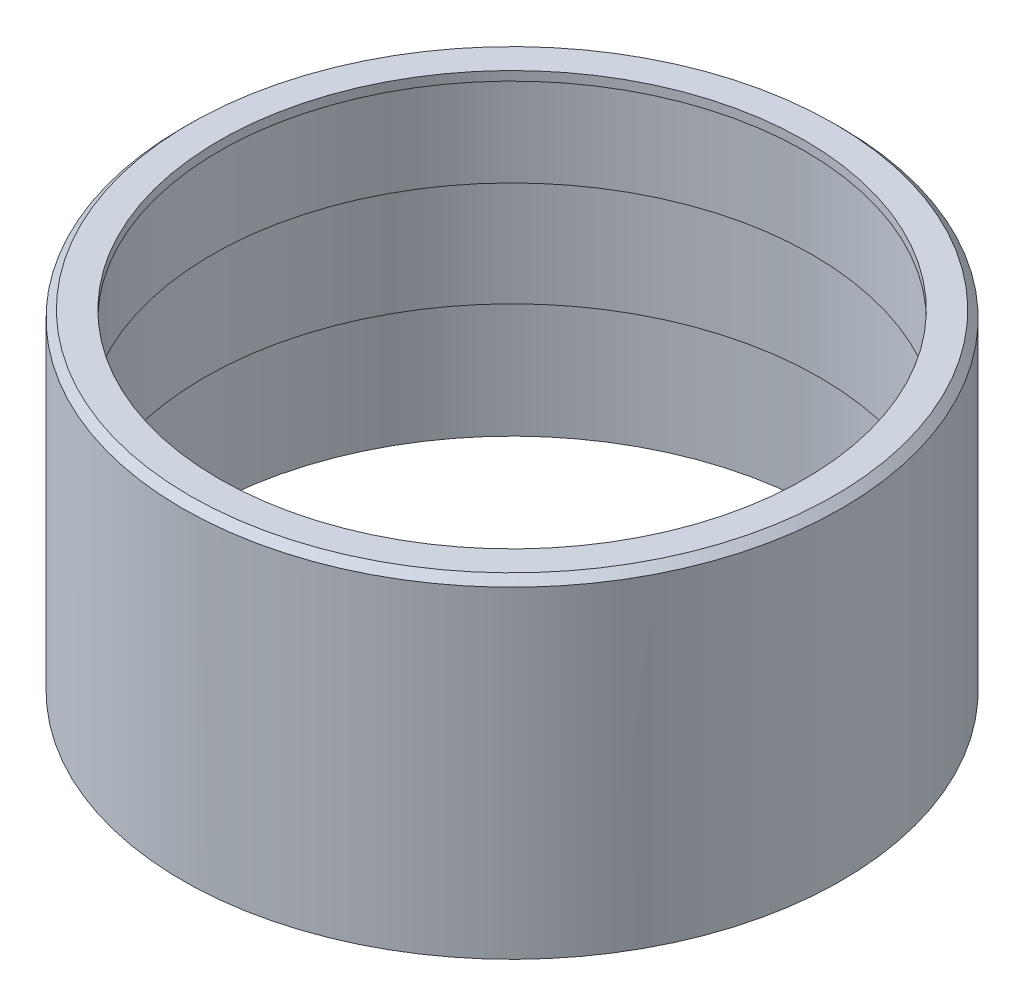
ISO-10303-21;
HEADER;
FILE_DESCRIPTION(('STEP AP214'),'2;1');
FILE_NAME('part.step','',(''),(''),'','','');
FILE_SCHEMA(('AUTOMOTIVE_DESIGN { 1 0 10303 214 1 1 1 1 }'));
ENDSEC;
DATA;
#1=APPLICATION_CONTEXT('core data for automotive mechanical design processes');
#2=APPLICATION_PROTOCOL_DEFINITION('international standard','automotive_design',2000,#1);
#3=PRODUCT_CONTEXT('',#1,'mechanical');
#4=PRODUCT('Part','Part','',(#3));
#5=PRODUCT_RELATED_PRODUCT_CATEGORY('part','',(#4));
#6=PRODUCT_DEFINITION_FORMATION('','',#4);
#7=PRODUCT_DEFINITION_CONTEXT('part definition',#1,'design');
#8=PRODUCT_DEFINITION('design','',#6,#7);
#9=PRODUCT_DEFINITION_SHAPE('','',#8);
#10=(LENGTH_UNIT() NAMED_UNIT(*) SI_UNIT(.MILLI.,.METRE.));
#11=(NAMED_UNIT(*) PLANE_ANGLE_UNIT() SI_UNIT($,.RADIAN.));
#12=(NAMED_UNIT(*) SI_UNIT($,.STERADIAN.) SOLID_ANGLE_UNIT());
#13=UNCERTAINTY_MEASURE_WITH_UNIT(LENGTH_MEASURE(1.E-05),#10,'distance_accuracy_value','');
#14=(GEOMETRIC_REPRESENTATION_CONTEXT(3) GLOBAL_UNCERTAINTY_ASSIGNED_CONTEXT((#13)) GLOBAL_UNIT_ASSIGNED_CONTEXT((#10,
#11,#12)) REPRESENTATION_CONTEXT('',''));
#15=CARTESIAN_POINT('',(0.,0.,0.));
#16=DIRECTION('',(0.,0.,1.));
#17=DIRECTION('',(1.,0.,0.));
#18=AXIS2_PLACEMENT_3D('',#15,#16,#17);
#19=CARTESIAN_POINT('',(22.86,22.86,0.));
#20=DIRECTION('',(0.,1.,0.));
#21=DIRECTION('',(0.,0.,1.));
#22=AXIS2_PLACEMENT_3D('',#19,#20,#21);
#23=PLANE('',#22);
#24=CARTESIAN_POINT('',(0.,22.86,0.));
#25=DIRECTION('',(0.,1.,0.));
#26=DIRECTION('',(0.,0.,1.));
#27=AXIS2_PLACEMENT_3D('',#24,#25,#26);
#28=CIRCLE('',#27,22.352);
#29=CARTESIAN_POINT('',(0.,22.86,22.352));
#30=VERTEX_POINT('',#29);
#31=EDGE_CURVE('E11',#30,#30,#28,.T.);
#32=ORIENTED_EDGE('',*,*,#31,.T.);
#33=EDGE_LOOP('',(#32));
#34=FACE_BOUND('',#33,.T.);
#35=CARTESIAN_POINT('',(0.,22.86,0.));
#36=DIRECTION('',(0.,-1.,0.));
#37=DIRECTION('',(0.,0.,-1.));
#38=AXIS2_PLACEMENT_3D('',#35,#36,#37);
#39=CIRCLE('',#38,20.32);
#40=CARTESIAN_POINT('',(0.,22.86,-20.32));
#41=VERTEX_POINT('',#40);
#42=EDGE_CURVE('E78',#41,#41,#39,.T.);
#43=ORIENTED_EDGE('',*,*,#42,.T.);
#44=EDGE_LOOP('',(#43));
#45=FACE_BOUND('',#44,.T.);
#46=ADVANCED_FACE('F43',(#34,#45),#23,.T.);
#47=CARTESIAN_POINT('',(0.,-7.74131889682308,0.));
#48=DIRECTION('',(0.,-1.,0.));
#49=DIRECTION('',(0.,0.,-1.));
#50=AXIS2_PLACEMENT_3D('',#47,#48,#49);
#51=CYLINDRICAL_SURFACE('',#50,22.86);
#52=CARTESIAN_POINT('',(0.,22.352,0.));
#53=DIRECTION('',(0.,1.,0.));
#54=DIRECTION('',(0.,0.,1.));
#55=AXIS2_PLACEMENT_3D('',#52,#53,#54);
#56=CIRCLE('',#55,22.86);
#57=CARTESIAN_POINT('',(0.,22.352,22.86));
#58=VERTEX_POINT('',#57);
#59=EDGE_CURVE('E50',#58,#58,#56,.F.);
#60=ORIENTED_EDGE('',*,*,#59,.T.);
#61=EDGE_LOOP('',(#60));
#62=FACE_BOUND('',#61,.T.);
#63=CARTESIAN_POINT('',(0.,0.,0.));
#64=DIRECTION('',(0.,-1.,0.));
#65=DIRECTION('',(0.,0.,-1.));
#66=AXIS2_PLACEMENT_3D('',#63,#64,#65);
#67=CIRCLE('',#66,22.86);
#68=CARTESIAN_POINT('',(0.,0.,-22.86));
#69=VERTEX_POINT('',#68);
#70=EDGE_CURVE('E54',#69,#69,#67,.T.);
#71=ORIENTED_EDGE('',*,*,#70,.F.);
#72=EDGE_LOOP('',(#71));
#73=FACE_BOUND('',#72,.T.);
#74=ADVANCED_FACE('F89',(#62,#73),#51,.T.);
#75=CARTESIAN_POINT('',(22.225,0.,0.));
#76=DIRECTION('',(0.,-1.,0.));
#77=DIRECTION('',(0.,0.,-1.));
#78=AXIS2_PLACEMENT_3D('',#75,#76,#77);
#79=PLANE('',#78);
#80=ORIENTED_EDGE('',*,*,#70,.T.);
#81=EDGE_LOOP('',(#80));
#82=FACE_BOUND('',#81,.T.);
#83=CARTESIAN_POINT('',(0.,0.,0.));
#84=DIRECTION('',(0.,-1.,0.));
#85=DIRECTION('',(0.,0.,-1.));
#86=AXIS2_PLACEMENT_3D('',#83,#84,#85);
#87=CIRCLE('',#86,21.59);
#88=CARTESIAN_POINT('',(0.,0.,-21.59));
#89=VERTEX_POINT('',#88);
#90=EDGE_CURVE('E81',#89,#89,#87,.T.);
#91=ORIENTED_EDGE('',*,*,#90,.F.);
#92=EDGE_LOOP('',(#91));
#93=FACE_BOUND('',#92,.T.);
#94=ADVANCED_FACE('F87',(#82,#93),#79,.T.);
#95=CARTESIAN_POINT('',(0.,-7.74131889682308,0.));
#96=DIRECTION('',(0.,-1.,0.));
#97=DIRECTION('',(0.,0.,-1.));
#98=AXIS2_PLACEMENT_3D('',#95,#96,#97);
#99=CYLINDRICAL_SURFACE('',#98,21.59);
#100=CARTESIAN_POINT('',(0.,8.128,0.));
#101=DIRECTION('',(0.,-1.,0.));
#102=DIRECTION('',(0.,0.,-1.));
#103=AXIS2_PLACEMENT_3D('',#100,#101,#102);
#104=CIRCLE('',#103,21.59);
#105=CARTESIAN_POINT('',(0.,8.128,-21.59));
#106=VERTEX_POINT('',#105);
#107=EDGE_CURVE('E58',#106,#106,#104,.T.);
#108=ORIENTED_EDGE('',*,*,#107,.F.);
#109=EDGE_LOOP('',(#108));
#110=FACE_BOUND('',#109,.T.);
#111=ORIENTED_EDGE('',*,*,#90,.T.);
#112=EDGE_LOOP('',(#111));
#113=FACE_BOUND('',#112,.T.);
#114=ADVANCED_FACE('F85',(#110,#113),#99,.F.);
#115=CARTESIAN_POINT('',(21.336,8.128,0.));
#116=DIRECTION('',(0.,-1.,0.));
#117=DIRECTION('',(0.,0.,-1.));
#118=AXIS2_PLACEMENT_3D('',#115,#116,#117);
#119=PLANE('',#118);
#120=ORIENTED_EDGE('',*,*,#107,.T.);
#121=EDGE_LOOP('',(#120));
#122=FACE_BOUND('',#121,.T.);
#123=CARTESIAN_POINT('',(0.,8.128,0.));
#124=DIRECTION('',(0.,-1.,0.));
#125=DIRECTION('',(0.,0.,-1.));
#126=AXIS2_PLACEMENT_3D('',#123,#124,#125);
#127=CIRCLE('',#126,21.336);
#128=CARTESIAN_POINT('',(0.,8.128,-21.336));
#129=VERTEX_POINT('',#128);
#130=EDGE_CURVE('E63',#129,#129,#127,.T.);
#131=ORIENTED_EDGE('',*,*,#130,.F.);
#132=EDGE_LOOP('',(#131));
#133=FACE_BOUND('',#132,.T.);
#134=ADVANCED_FACE('F96',(#122,#133),#119,.T.);
#135=CARTESIAN_POINT('',(0.,-7.74131889682308,0.));
#136=DIRECTION('',(0.,-1.,0.));
#137=DIRECTION('',(0.,0.,-1.));
#138=AXIS2_PLACEMENT_3D('',#135,#136,#137);
#139=CYLINDRICAL_SURFACE('',#138,21.336);
#140=ORIENTED_EDGE('',*,*,#130,.T.);
#141=EDGE_LOOP('',(#140));
#142=FACE_BOUND('',#141,.T.);
#143=CARTESIAN_POINT('',(0.,15.748,0.));
#144=DIRECTION('',(0.,-1.,0.));
#145=DIRECTION('',(0.,0.,-1.));
#146=AXIS2_PLACEMENT_3D('',#143,#144,#145);
#147=CIRCLE('',#146,21.336);
#148=CARTESIAN_POINT('',(0.,15.748,-21.336));
#149=VERTEX_POINT('',#148);
#150=EDGE_CURVE('E66',#149,#149,#147,.T.);
#151=ORIENTED_EDGE('',*,*,#150,.F.);
#152=EDGE_LOOP('',(#151));
#153=FACE_BOUND('',#152,.T.);
#154=ADVANCED_FACE('F126',(#142,#153),#139,.F.);
#155=CARTESIAN_POINT('',(20.828,15.748,0.));
#156=DIRECTION('',(0.,-1.,0.));
#157=DIRECTION('',(0.,0.,-1.));
#158=AXIS2_PLACEMENT_3D('',#155,#156,#157);
#159=PLANE('',#158);
#160=ORIENTED_EDGE('',*,*,#150,.T.);
#161=EDGE_LOOP('',(#160));
#162=FACE_BOUND('',#161,.T.);
#163=CARTESIAN_POINT('',(0.,15.748,0.));
#164=DIRECTION('',(0.,-1.,0.));
#165=DIRECTION('',(0.,0.,-1.));
#166=AXIS2_PLACEMENT_3D('',#163,#164,#165);
#167=CIRCLE('',#166,20.828);
#168=CARTESIAN_POINT('',(0.,15.748,-20.828));
#169=VERTEX_POINT('',#168);
#170=EDGE_CURVE('E69',#169,#169,#167,.T.);
#171=ORIENTED_EDGE('',*,*,#170,.F.);
#172=EDGE_LOOP('',(#171));
#173=FACE_BOUND('',#172,.T.);
#174=ADVANCED_FACE('F122',(#162,#173),#159,.T.);
#175=CARTESIAN_POINT('',(0.,-7.74131889682308,0.));
#176=DIRECTION('',(0.,-1.,0.));
#177=DIRECTION('',(0.,0.,-1.));
#178=AXIS2_PLACEMENT_3D('',#175,#176,#177);
#179=CYLINDRICAL_SURFACE('',#178,20.828);
#180=ORIENTED_EDGE('',*,*,#170,.T.);
#181=EDGE_LOOP('',(#180));
#182=FACE_BOUND('',#181,.T.);
#183=CARTESIAN_POINT('',(0.,22.225,0.));
#184=DIRECTION('',(0.,-1.,0.));
#185=DIRECTION('',(0.,0.,-1.));
#186=AXIS2_PLACEMENT_3D('',#183,#184,#185);
#187=CIRCLE('',#186,20.828);
#188=CARTESIAN_POINT('',(0.,22.225,-20.828));
#189=VERTEX_POINT('',#188);
#190=EDGE_CURVE('E72',#189,#189,#187,.T.);
#191=ORIENTED_EDGE('',*,*,#190,.F.);
#192=EDGE_LOOP('',(#191));
#193=FACE_BOUND('',#192,.T.);
#194=ADVANCED_FACE('F116',(#182,#193),#179,.F.);
#195=CARTESIAN_POINT('',(20.32,22.225,0.));
#196=DIRECTION('',(0.,-1.,0.));
#197=DIRECTION('',(0.,0.,-1.));
#198=AXIS2_PLACEMENT_3D('',#195,#196,#197);
#199=PLANE('',#198);
#200=ORIENTED_EDGE('',*,*,#190,.T.);
#201=EDGE_LOOP('',(#200));
#202=FACE_BOUND('',#201,.T.);
#203=CARTESIAN_POINT('',(0.,22.225,0.));
#204=DIRECTION('',(0.,-1.,0.));
#205=DIRECTION('',(0.,0.,-1.));
#206=AXIS2_PLACEMENT_3D('',#203,#204,#205);
#207=CIRCLE('',#206,20.32);
#208=CARTESIAN_POINT('',(0.,22.225,-20.32));
#209=VERTEX_POINT('',#208);
#210=EDGE_CURVE('E75',#209,#209,#207,.T.);
#211=ORIENTED_EDGE('',*,*,#210,.F.);
#212=EDGE_LOOP('',(#211));
#213=FACE_BOUND('',#212,.T.);
#214=ADVANCED_FACE('F109',(#202,#213),#199,.T.);
#215=CARTESIAN_POINT('',(0.,-7.74131889682308,0.));
#216=DIRECTION('',(0.,-1.,0.));
#217=DIRECTION('',(0.,0.,-1.));
#218=AXIS2_PLACEMENT_3D('',#215,#216,#217);
#219=CYLINDRICAL_SURFACE('',#218,20.32);
#220=ORIENTED_EDGE('',*,*,#210,.T.);
#221=EDGE_LOOP('',(#220));
#222=FACE_BOUND('',#221,.T.);
#223=ORIENTED_EDGE('',*,*,#42,.F.);
#224=EDGE_LOOP('',(#223));
#225=FACE_BOUND('',#224,.T.);
#226=ADVANCED_FACE('F107',(#222,#225),#219,.F.);
#227=CARTESIAN_POINT('',(0.,22.352,0.));
#228=DIRECTION('',(0.,-1.,0.));
#229=DIRECTION('',(0.,0.,-1.));
#230=AXIS2_PLACEMENT_3D('',#227,#228,#229);
#231=CONICAL_SURFACE('',#230,22.86,0.785398163397448);
#232=ORIENTED_EDGE('',*,*,#31,.F.);
#233=EDGE_LOOP('',(#232));
#234=FACE_BOUND('',#233,.T.);
#235=ORIENTED_EDGE('',*,*,#59,.F.);
#236=EDGE_LOOP('',(#235));
#237=FACE_BOUND('',#236,.T.);
#238=ADVANCED_FACE('F45',(#234,#237),#231,.T.);
#239=CLOSED_SHELL('',(#46,#74,#94,#114,#134,#154,#174,#194,#214,#226,#238));
#240=MANIFOLD_SOLID_BREP('B2',#239);
#241=ADVANCED_BREP_SHAPE_REPRESENTATION('',(#18,#240),#14);
#242=SHAPE_DEFINITION_REPRESENTATION(#9,#241);
ENDSEC;
END-ISO-10303-21;
